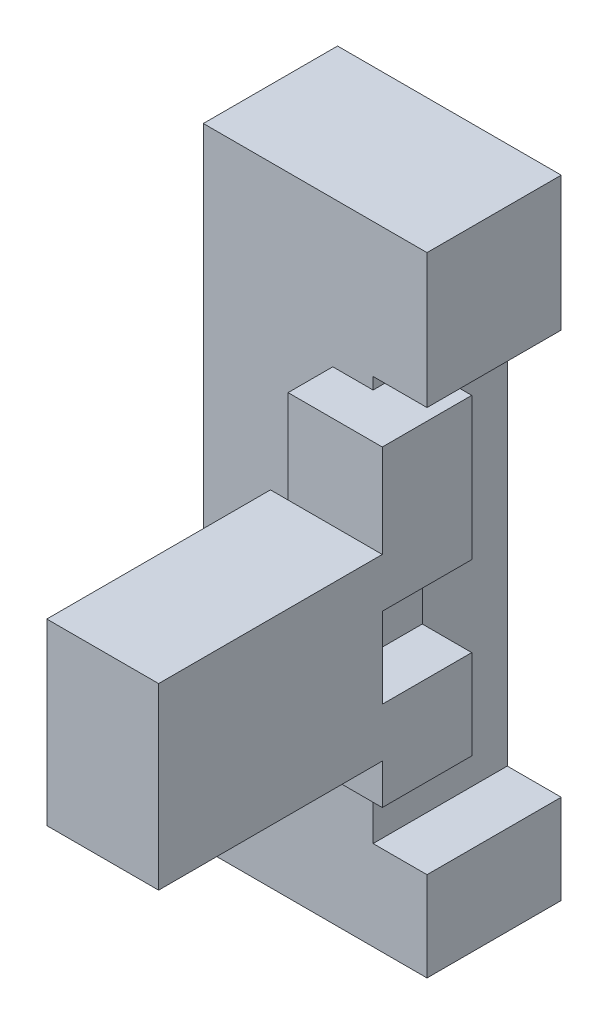
ISO-10303-21;
HEADER;
FILE_DESCRIPTION(('STEP AP214'),'2;1');
FILE_NAME('part.step','',(''),(''),'','','');
FILE_SCHEMA(('AUTOMOTIVE_DESIGN { 1 0 10303 214 1 1 1 1 }'));
ENDSEC;
DATA;
#1=APPLICATION_CONTEXT('core data for automotive mechanical design processes');
#2=APPLICATION_PROTOCOL_DEFINITION('international standard','automotive_design',2000,#1);
#3=PRODUCT_CONTEXT('',#1,'mechanical');
#4=PRODUCT('Part','Part','',(#3));
#5=PRODUCT_RELATED_PRODUCT_CATEGORY('part','',(#4));
#6=PRODUCT_DEFINITION_FORMATION('','',#4);
#7=PRODUCT_DEFINITION_CONTEXT('part definition',#1,'design');
#8=PRODUCT_DEFINITION('design','',#6,#7);
#9=PRODUCT_DEFINITION_SHAPE('','',#8);
#10=(LENGTH_UNIT() NAMED_UNIT(*) SI_UNIT(.MILLI.,.METRE.));
#11=(NAMED_UNIT(*) PLANE_ANGLE_UNIT() SI_UNIT($,.RADIAN.));
#12=(NAMED_UNIT(*) SI_UNIT($,.STERADIAN.) SOLID_ANGLE_UNIT());
#13=UNCERTAINTY_MEASURE_WITH_UNIT(LENGTH_MEASURE(1.E-05),#10,'distance_accuracy_value','');
#14=(GEOMETRIC_REPRESENTATION_CONTEXT(3) GLOBAL_UNCERTAINTY_ASSIGNED_CONTEXT((#13)) GLOBAL_UNIT_ASSIGNED_CONTEXT((#10,
#11,#12)) REPRESENTATION_CONTEXT('',''));
#15=CARTESIAN_POINT('',(0.,0.,0.));
#16=DIRECTION('',(0.,0.,1.));
#17=DIRECTION('',(1.,0.,0.));
#18=AXIS2_PLACEMENT_3D('',#15,#16,#17);
#19=CARTESIAN_POINT('',(0.,0.,2.));
#20=DIRECTION('',(0.,0.,1.));
#21=DIRECTION('',(1.,0.,0.));
#22=AXIS2_PLACEMENT_3D('',#19,#20,#21);
#23=PLANE('',#22);
#24=DIRECTION('',(1.,0.,0.));
#25=VECTOR('',#24,1.);
#26=CARTESIAN_POINT('',(45.220609876218,-8.72106443700142,2.));
#27=LINE('',#26,#25);
#28=CARTESIAN_POINT('',(43.114751496181,-8.72106443700142,2.));
#29=VERTEX_POINT('',#28);
#30=CARTESIAN_POINT('',(45.220609876218,-8.72106443700142,2.));
#31=VERTEX_POINT('',#30);
#32=EDGE_CURVE('E294',#29,#31,#27,.T.);
#33=ORIENTED_EDGE('',*,*,#32,.F.);
#34=DIRECTION('',(0.,-1.,0.));
#35=VECTOR('',#34,1.);
#36=CARTESIAN_POINT('',(43.114751496181,-9.62106443700142,2.));
#37=LINE('',#36,#35);
#38=CARTESIAN_POINT('',(43.114751496181,-9.62106443700142,2.));
#39=VERTEX_POINT('',#38);
#40=EDGE_CURVE('E321',#29,#39,#37,.T.);
#41=ORIENTED_EDGE('',*,*,#40,.T.);
#42=DIRECTION('',(1.,0.,0.));
#43=VECTOR('',#42,1.);
#44=CARTESIAN_POINT('',(44.114751496181,-9.62106443700142,2.));
#45=LINE('',#44,#43);
#46=CARTESIAN_POINT('',(45.220609876218,-9.62106443700142,2.));
#47=VERTEX_POINT('',#46);
#48=EDGE_CURVE('E324',#39,#47,#45,.T.);
#49=ORIENTED_EDGE('',*,*,#48,.T.);
#50=DIRECTION('',(0.,1.,0.));
#51=VECTOR('',#50,1.);
#52=CARTESIAN_POINT('',(45.220609876218,-7.62106443700142,2.));
#53=LINE('',#52,#51);
#54=EDGE_CURVE('E56',#47,#31,#53,.T.);
#55=ORIENTED_EDGE('',*,*,#54,.T.);
#56=EDGE_LOOP('',(#33,#41,#49,#55));
#57=FACE_BOUND('',#56,.T.);
#58=ADVANCED_FACE('F33',(#57),#23,.T.);
#59=CARTESIAN_POINT('',(44.714751496181,-7.62106443700142,2.));
#60=DIRECTION('',(0.,-1.,0.));
#61=DIRECTION('',(0.,0.,-1.));
#62=AXIS2_PLACEMENT_3D('',#59,#60,#61);
#63=PLANE('',#62);
#64=DIRECTION('',(-1.,0.,0.));
#65=VECTOR('',#64,1.);
#66=CARTESIAN_POINT('',(44.714751496181,-7.62106443700142,0.));
#67=LINE('',#66,#65);
#68=CARTESIAN_POINT('',(45.220609876218,-7.62106443700142,0.));
#69=VERTEX_POINT('',#68);
#70=CARTESIAN_POINT('',(44.114751496181,-7.62106443700142,0.));
#71=VERTEX_POINT('',#70);
#72=EDGE_CURVE('E306',#69,#71,#67,.T.);
#73=ORIENTED_EDGE('',*,*,#72,.T.);
#74=DIRECTION('',(0.,0.,-1.));
#75=VECTOR('',#74,1.);
#76=CARTESIAN_POINT('',(44.114751496181,-7.62106443700142,2.));
#77=LINE('',#76,#75);
#78=CARTESIAN_POINT('',(44.114751496181,-7.62106443700142,2.));
#79=VERTEX_POINT('',#78);
#80=EDGE_CURVE('E364',#79,#71,#77,.T.);
#81=ORIENTED_EDGE('',*,*,#80,.F.);
#82=DIRECTION('',(-1.,0.,0.));
#83=VECTOR('',#82,1.);
#84=CARTESIAN_POINT('',(45.220609876218,-7.62106443700142,2.));
#85=LINE('',#84,#83);
#86=CARTESIAN_POINT('',(45.220609876218,-7.62106443700142,2.));
#87=VERTEX_POINT('',#86);
#88=EDGE_CURVE('E307',#87,#79,#85,.T.);
#89=ORIENTED_EDGE('',*,*,#88,.F.);
#90=DIRECTION('',(0.,0.,-1.));
#91=VECTOR('',#90,1.);
#92=CARTESIAN_POINT('',(45.220609876218,-7.62106443700142,2.));
#93=LINE('',#92,#91);
#94=EDGE_CURVE('E328',#87,#69,#93,.T.);
#95=ORIENTED_EDGE('',*,*,#94,.T.);
#96=EDGE_LOOP('',(#73,#81,#89,#95));
#97=FACE_BOUND('',#96,.T.);
#98=ADVANCED_FACE('F35',(#97),#63,.F.);
#99=CARTESIAN_POINT('',(44.114751496181,-5.82106443700142,2.));
#100=DIRECTION('',(-1.,0.,0.));
#101=DIRECTION('',(0.,0.,1.));
#102=AXIS2_PLACEMENT_3D('',#99,#100,#101);
#103=PLANE('',#102);
#104=DIRECTION('',(0.,1.,0.));
#105=VECTOR('',#104,1.);
#106=CARTESIAN_POINT('',(44.114751496181,-5.82106443700142,0.));
#107=LINE('',#106,#105);
#108=CARTESIAN_POINT('',(44.114751496181,-5.82106443700142,0.));
#109=VERTEX_POINT('',#108);
#110=EDGE_CURVE('E330',#71,#109,#107,.T.);
#111=ORIENTED_EDGE('',*,*,#110,.T.);
#112=DIRECTION('',(0.,0.,-1.));
#113=VECTOR('',#112,1.);
#114=CARTESIAN_POINT('',(44.114751496181,-5.82106443700142,2.));
#115=LINE('',#114,#113);
#116=CARTESIAN_POINT('',(44.114751496181,-5.82106443700142,2.));
#117=VERTEX_POINT('',#116);
#118=EDGE_CURVE('E361',#117,#109,#115,.T.);
#119=ORIENTED_EDGE('',*,*,#118,.F.);
#120=DIRECTION('',(0.,1.,0.));
#121=VECTOR('',#120,1.);
#122=CARTESIAN_POINT('',(44.114751496181,-5.82106443700142,2.));
#123=LINE('',#122,#121);
#124=EDGE_CURVE('E310',#79,#117,#123,.T.);
#125=ORIENTED_EDGE('',*,*,#124,.F.);
#126=ORIENTED_EDGE('',*,*,#80,.T.);
#127=EDGE_LOOP('',(#111,#119,#125,#126));
#128=FACE_BOUND('',#127,.T.);
#129=ADVANCED_FACE('F408',(#128),#103,.F.);
#130=CARTESIAN_POINT('',(45.220609876218,-5.82106443700142,2.));
#131=DIRECTION('',(0.,1.,0.));
#132=DIRECTION('',(0.,0.,1.));
#133=AXIS2_PLACEMENT_3D('',#130,#131,#132);
#134=PLANE('',#133);
#135=DIRECTION('',(1.,0.,0.));
#136=VECTOR('',#135,1.);
#137=CARTESIAN_POINT('',(45.220609876218,-5.82106443700142,0.));
#138=LINE('',#137,#136);
#139=CARTESIAN_POINT('',(45.220609876218,-5.82106443700142,0.));
#140=VERTEX_POINT('',#139);
#141=EDGE_CURVE('E332',#109,#140,#138,.T.);
#142=ORIENTED_EDGE('',*,*,#141,.T.);
#143=DIRECTION('',(0.,0.,-1.));
#144=VECTOR('',#143,1.);
#145=CARTESIAN_POINT('',(45.220609876218,-5.82106443700142,2.));
#146=LINE('',#145,#144);
#147=CARTESIAN_POINT('',(45.220609876218,-5.82106443700142,2.));
#148=VERTEX_POINT('',#147);
#149=EDGE_CURVE('E358',#148,#140,#146,.T.);
#150=ORIENTED_EDGE('',*,*,#149,.F.);
#151=DIRECTION('',(1.,0.,0.));
#152=VECTOR('',#151,1.);
#153=CARTESIAN_POINT('',(45.220609876218,-5.82106443700142,2.));
#154=LINE('',#153,#152);
#155=EDGE_CURVE('E314',#117,#148,#154,.T.);
#156=ORIENTED_EDGE('',*,*,#155,.F.);
#157=ORIENTED_EDGE('',*,*,#118,.T.);
#158=EDGE_LOOP('',(#142,#150,#156,#157));
#159=FACE_BOUND('',#158,.T.);
#160=ADVANCED_FACE('F415',(#159),#134,.F.);
#161=CARTESIAN_POINT('',(43.114751496181,-2.64106443700142,2.));
#162=DIRECTION('',(0.,-1.,0.));
#163=DIRECTION('',(0.,0.,-1.));
#164=AXIS2_PLACEMENT_3D('',#161,#162,#163);
#165=PLANE('',#164);
#166=DIRECTION('',(-1.,0.,0.));
#167=VECTOR('',#166,1.);
#168=CARTESIAN_POINT('',(43.114751496181,-2.64106443700142,0.));
#169=LINE('',#168,#167);
#170=CARTESIAN_POINT('',(45.220609876218,-2.64106443700142,0.));
#171=VERTEX_POINT('',#170);
#172=CARTESIAN_POINT('',(44.014751496181,-2.64106443700142,0.));
#173=VERTEX_POINT('',#172);
#174=EDGE_CURVE('E337',#171,#173,#169,.T.);
#175=ORIENTED_EDGE('',*,*,#174,.T.);
#176=DIRECTION('',(0.,0.,1.));
#177=VECTOR('',#176,1.);
#178=CARTESIAN_POINT('',(44.014751496181,-2.64106443700142,2.));
#179=LINE('',#178,#177);
#180=CARTESIAN_POINT('',(44.014751496181,-2.64106443700142,1.));
#181=VERTEX_POINT('',#180);
#182=EDGE_CURVE('E48',#173,#181,#179,.T.);
#183=ORIENTED_EDGE('',*,*,#182,.T.);
#184=DIRECTION('',(-1.,0.,0.));
#185=VECTOR('',#184,1.);
#186=CARTESIAN_POINT('',(43.114751496181,-2.64106443700142,1.));
#187=LINE('',#186,#185);
#188=CARTESIAN_POINT('',(43.114751496181,-2.64106443700142,1.));
#189=VERTEX_POINT('',#188);
#190=EDGE_CURVE('E269',#181,#189,#187,.T.);
#191=ORIENTED_EDGE('',*,*,#190,.T.);
#192=DIRECTION('',(0.,0.,-1.));
#193=VECTOR('',#192,1.);
#194=CARTESIAN_POINT('',(43.114751496181,-2.64106443700142,2.));
#195=LINE('',#194,#193);
#196=CARTESIAN_POINT('',(43.114751496181,-2.64106443700142,2.));
#197=VERTEX_POINT('',#196);
#198=EDGE_CURVE('E352',#197,#189,#195,.T.);
#199=ORIENTED_EDGE('',*,*,#198,.F.);
#200=DIRECTION('',(-1.,0.,0.));
#201=VECTOR('',#200,1.);
#202=CARTESIAN_POINT('',(43.114751496181,-2.64106443700142,2.));
#203=LINE('',#202,#201);
#204=CARTESIAN_POINT('',(45.220609876218,-2.64106443700142,2.));
#205=VERTEX_POINT('',#204);
#206=EDGE_CURVE('E319',#205,#197,#203,.T.);
#207=ORIENTED_EDGE('',*,*,#206,.F.);
#208=DIRECTION('',(0.,0.,-1.));
#209=VECTOR('',#208,1.);
#210=CARTESIAN_POINT('',(45.220609876218,-2.64106443700142,2.));
#211=LINE('',#210,#209);
#212=EDGE_CURVE('E355',#205,#171,#211,.T.);
#213=ORIENTED_EDGE('',*,*,#212,.T.);
#214=EDGE_LOOP('',(#175,#183,#191,#199,#207,#213));
#215=FACE_BOUND('',#214,.T.);
#216=ADVANCED_FACE('F417',(#215),#165,.F.);
#217=CARTESIAN_POINT('',(43.114751496181,-9.62106443700142,2.));
#218=DIRECTION('',(1.,0.,0.));
#219=DIRECTION('',(0.,0.,-1.));
#220=AXIS2_PLACEMENT_3D('',#217,#218,#219);
#221=PLANE('',#220);
#222=ORIENTED_EDGE('',*,*,#198,.T.);
#223=DIRECTION('',(0.,-1.,0.));
#224=VECTOR('',#223,1.);
#225=CARTESIAN_POINT('',(43.114751496181,-9.62106443700142,1.));
#226=LINE('',#225,#224);
#227=CARTESIAN_POINT('',(43.114751496181,-9.62106443700142,1.));
#228=VERTEX_POINT('',#227);
#229=EDGE_CURVE('E266',#189,#228,#226,.T.);
#230=ORIENTED_EDGE('',*,*,#229,.T.);
#231=DIRECTION('',(0.,0.,-1.));
#232=VECTOR('',#231,1.);
#233=CARTESIAN_POINT('',(43.114751496181,-9.62106443700142,2.));
#234=LINE('',#233,#232);
#235=EDGE_CURVE('E349',#39,#228,#234,.T.);
#236=ORIENTED_EDGE('',*,*,#235,.F.);
#237=ORIENTED_EDGE('',*,*,#40,.F.);
#238=CARTESIAN_POINT('',(43.114751496181,-4.72106443700142,2.));
#239=VERTEX_POINT('',#238);
#240=EDGE_CURVE('E325',#239,#29,#37,.T.);
#241=ORIENTED_EDGE('',*,*,#240,.F.);
#242=EDGE_CURVE('E322',#197,#239,#37,.T.);
#243=ORIENTED_EDGE('',*,*,#242,.F.);
#244=EDGE_LOOP('',(#222,#230,#236,#237,#241,#243));
#245=FACE_BOUND('',#244,.T.);
#246=ADVANCED_FACE('F397',(#245),#221,.F.);
#247=CARTESIAN_POINT('',(45.220609876218,-9.62106443700142,2.));
#248=DIRECTION('',(0.,1.,0.));
#249=DIRECTION('',(0.,0.,1.));
#250=AXIS2_PLACEMENT_3D('',#247,#248,#249);
#251=PLANE('',#250);
#252=DIRECTION('',(1.,0.,0.));
#253=VECTOR('',#252,1.);
#254=CARTESIAN_POINT('',(45.220609876218,-9.62106443700142,1.));
#255=LINE('',#254,#253);
#256=CARTESIAN_POINT('',(44.014751496181,-9.62106443700142,1.));
#257=VERTEX_POINT('',#256);
#258=EDGE_CURVE('E11',#228,#257,#255,.T.);
#259=ORIENTED_EDGE('',*,*,#258,.T.);
#260=DIRECTION('',(0.,0.,-1.));
#261=VECTOR('',#260,1.);
#262=CARTESIAN_POINT('',(44.014751496181,-9.62106443700142,2.));
#263=LINE('',#262,#261);
#264=CARTESIAN_POINT('',(44.014751496181,-9.62106443700142,0.));
#265=VERTEX_POINT('',#264);
#266=EDGE_CURVE('E251',#257,#265,#263,.T.);
#267=ORIENTED_EDGE('',*,*,#266,.T.);
#268=DIRECTION('',(1.,0.,0.));
#269=VECTOR('',#268,1.);
#270=CARTESIAN_POINT('',(45.220609876218,-9.62106443700142,0.));
#271=LINE('',#270,#269);
#272=CARTESIAN_POINT('',(45.220609876218,-9.62106443700142,0.));
#273=VERTEX_POINT('',#272);
#274=EDGE_CURVE('E340',#265,#273,#271,.T.);
#275=ORIENTED_EDGE('',*,*,#274,.T.);
#276=DIRECTION('',(0.,0.,-1.));
#277=VECTOR('',#276,1.);
#278=CARTESIAN_POINT('',(45.220609876218,-9.62106443700142,2.));
#279=LINE('',#278,#277);
#280=EDGE_CURVE('E346',#47,#273,#279,.T.);
#281=ORIENTED_EDGE('',*,*,#280,.F.);
#282=ORIENTED_EDGE('',*,*,#48,.F.);
#283=ORIENTED_EDGE('',*,*,#235,.T.);
#284=EDGE_LOOP('',(#259,#267,#275,#281,#282,#283));
#285=FACE_BOUND('',#284,.T.);
#286=ADVANCED_FACE('F399',(#285),#251,.F.);
#287=CARTESIAN_POINT('',(45.220609876218,-7.62106443700142,2.));
#288=DIRECTION('',(-1.,0.,0.));
#289=DIRECTION('',(0.,0.,1.));
#290=AXIS2_PLACEMENT_3D('',#287,#288,#289);
#291=PLANE('',#290);
#292=DIRECTION('',(0.,1.,0.));
#293=VECTOR('',#292,1.);
#294=CARTESIAN_POINT('',(45.220609876218,-7.62106443700142,0.));
#295=LINE('',#294,#293);
#296=EDGE_CURVE('E311',#273,#69,#295,.T.);
#297=ORIENTED_EDGE('',*,*,#296,.T.);
#298=ORIENTED_EDGE('',*,*,#94,.F.);
#299=DIRECTION('',(0.,1.,0.));
#300=VECTOR('',#299,1.);
#301=CARTESIAN_POINT('',(45.220609876218,-4.72106443700142,2.));
#302=LINE('',#301,#300);
#303=EDGE_CURVE('E272',#87,#148,#302,.T.);
#304=ORIENTED_EDGE('',*,*,#303,.T.);
#305=ORIENTED_EDGE('',*,*,#149,.T.);
#306=DIRECTION('',(0.,1.,0.));
#307=VECTOR('',#306,1.);
#308=CARTESIAN_POINT('',(45.220609876218,-2.64106443700142,0.));
#309=LINE('',#308,#307);
#310=EDGE_CURVE('E335',#140,#171,#309,.T.);
#311=ORIENTED_EDGE('',*,*,#310,.T.);
#312=ORIENTED_EDGE('',*,*,#212,.F.);
#313=DIRECTION('',(0.,1.,0.));
#314=VECTOR('',#313,1.);
#315=CARTESIAN_POINT('',(45.220609876218,-4.64106443700142,2.));
#316=LINE('',#315,#314);
#317=CARTESIAN_POINT('',(45.220609876218,-4.72106443700142,2.));
#318=VERTEX_POINT('',#317);
#319=EDGE_CURVE('E317',#318,#205,#316,.T.);
#320=ORIENTED_EDGE('',*,*,#319,.F.);
#321=DIRECTION('',(0.,0.,-1.));
#322=VECTOR('',#321,1.);
#323=CARTESIAN_POINT('',(45.220609876218,-4.72106443700142,7.));
#324=LINE('',#323,#322);
#325=CARTESIAN_POINT('',(45.220609876218,-4.72106443700142,7.));
#326=VERTEX_POINT('',#325);
#327=EDGE_CURVE('E303',#326,#318,#324,.T.);
#328=ORIENTED_EDGE('',*,*,#327,.F.);
#329=DIRECTION('',(0.,1.,0.));
#330=VECTOR('',#329,1.);
#331=CARTESIAN_POINT('',(45.220609876218,-4.72106443700142,7.));
#332=LINE('',#331,#330);
#333=CARTESIAN_POINT('',(45.220609876218,-8.72106443700142,7.));
#334=VERTEX_POINT('',#333);
#335=EDGE_CURVE('E273',#334,#326,#332,.T.);
#336=ORIENTED_EDGE('',*,*,#335,.F.);
#337=DIRECTION('',(0.,0.,-1.));
#338=VECTOR('',#337,1.);
#339=CARTESIAN_POINT('',(45.220609876218,-8.72106443700142,7.));
#340=LINE('',#339,#338);
#341=EDGE_CURVE('E283',#334,#31,#340,.T.);
#342=ORIENTED_EDGE('',*,*,#341,.T.);
#343=ORIENTED_EDGE('',*,*,#54,.F.);
#344=ORIENTED_EDGE('',*,*,#280,.T.);
#345=EDGE_LOOP('',(#297,#298,#304,#305,#311,#312,#320,#328,#336,#342,#343,#344));
#346=FACE_BOUND('',#345,.T.);
#347=ADVANCED_FACE('F377',(#346),#291,.F.);
#348=DIRECTION('',(-1.,0.,0.));
#349=VECTOR('',#348,1.);
#350=CARTESIAN_POINT('',(45.220609876218,-4.72106443700142,2.));
#351=LINE('',#350,#349);
#352=EDGE_CURVE('E287',#318,#239,#351,.T.);
#353=ORIENTED_EDGE('',*,*,#352,.F.);
#354=ORIENTED_EDGE('',*,*,#319,.T.);
#355=ORIENTED_EDGE('',*,*,#206,.T.);
#356=ORIENTED_EDGE('',*,*,#242,.T.);
#357=EDGE_LOOP('',(#353,#354,#355,#356));
#358=FACE_BOUND('',#357,.T.);
#359=ADVANCED_FACE('F434',(#358),#23,.T.);
#360=CARTESIAN_POINT('',(0.,0.,0.));
#361=DIRECTION('',(0.,0.,1.));
#362=DIRECTION('',(1.,0.,0.));
#363=AXIS2_PLACEMENT_3D('',#360,#361,#362);
#364=PLANE('',#363);
#365=ORIENTED_EDGE('',*,*,#274,.F.);
#366=DIRECTION('',(0.,1.,0.));
#367=VECTOR('',#366,1.);
#368=CARTESIAN_POINT('',(44.014751496181,0.,0.));
#369=LINE('',#368,#367);
#370=EDGE_CURVE('E41',#265,#173,#369,.T.);
#371=ORIENTED_EDGE('',*,*,#370,.T.);
#372=ORIENTED_EDGE('',*,*,#174,.F.);
#373=ORIENTED_EDGE('',*,*,#310,.F.);
#374=ORIENTED_EDGE('',*,*,#141,.F.);
#375=ORIENTED_EDGE('',*,*,#110,.F.);
#376=ORIENTED_EDGE('',*,*,#72,.F.);
#377=ORIENTED_EDGE('',*,*,#296,.F.);
#378=EDGE_LOOP('',(#365,#371,#372,#373,#374,#375,#376,#377));
#379=FACE_BOUND('',#378,.T.);
#380=ADVANCED_FACE('F401',(#379),#364,.F.);
#381=CARTESIAN_POINT('',(0.,0.,2.));
#382=DIRECTION('',(0.,0.,-1.));
#383=DIRECTION('',(-1.,0.,0.));
#384=AXIS2_PLACEMENT_3D('',#381,#382,#383);
#385=PLANE('',#384);
#386=ORIENTED_EDGE('',*,*,#303,.F.);
#387=ORIENTED_EDGE('',*,*,#88,.T.);
#388=ORIENTED_EDGE('',*,*,#124,.T.);
#389=ORIENTED_EDGE('',*,*,#155,.T.);
#390=EDGE_LOOP('',(#386,#387,#388,#389));
#391=FACE_BOUND('',#390,.T.);
#392=ADVANCED_FACE('F412',(#391),#385,.T.);
#393=CARTESIAN_POINT('',(45.220609876218,-4.72106443700142,7.));
#394=DIRECTION('',(0.,-1.,0.));
#395=DIRECTION('',(0.,0.,-1.));
#396=AXIS2_PLACEMENT_3D('',#393,#394,#395);
#397=PLANE('',#396);
#398=ORIENTED_EDGE('',*,*,#352,.T.);
#399=CARTESIAN_POINT('',(42.720609876218,-4.72106443700142,2.));
#400=VERTEX_POINT('',#399);
#401=EDGE_CURVE('E286',#239,#400,#351,.T.);
#402=ORIENTED_EDGE('',*,*,#401,.T.);
#403=DIRECTION('',(0.,0.,-1.));
#404=VECTOR('',#403,1.);
#405=CARTESIAN_POINT('',(42.720609876218,-4.72106443700142,7.));
#406=LINE('',#405,#404);
#407=CARTESIAN_POINT('',(42.720609876218,-4.72106443700142,7.));
#408=VERTEX_POINT('',#407);
#409=EDGE_CURVE('E300',#408,#400,#406,.T.);
#410=ORIENTED_EDGE('',*,*,#409,.F.);
#411=DIRECTION('',(-1.,0.,0.));
#412=VECTOR('',#411,1.);
#413=CARTESIAN_POINT('',(45.220609876218,-4.72106443700142,7.));
#414=LINE('',#413,#412);
#415=EDGE_CURVE('E276',#326,#408,#414,.T.);
#416=ORIENTED_EDGE('',*,*,#415,.F.);
#417=ORIENTED_EDGE('',*,*,#327,.T.);
#418=EDGE_LOOP('',(#398,#402,#410,#416,#417));
#419=FACE_BOUND('',#418,.T.);
#420=ADVANCED_FACE('F422',(#419),#397,.F.);
#421=CARTESIAN_POINT('',(42.720609876218,-4.72106443700142,7.));
#422=DIRECTION('',(1.,0.,0.));
#423=DIRECTION('',(0.,0.,-1.));
#424=AXIS2_PLACEMENT_3D('',#421,#422,#423);
#425=PLANE('',#424);
#426=DIRECTION('',(0.,-1.,0.));
#427=VECTOR('',#426,1.);
#428=CARTESIAN_POINT('',(42.720609876218,-4.72106443700142,2.));
#429=LINE('',#428,#427);
#430=CARTESIAN_POINT('',(42.720609876218,-8.72106443700142,2.));
#431=VERTEX_POINT('',#430);
#432=EDGE_CURVE('E290',#400,#431,#429,.T.);
#433=ORIENTED_EDGE('',*,*,#432,.T.);
#434=DIRECTION('',(0.,0.,-1.));
#435=VECTOR('',#434,1.);
#436=CARTESIAN_POINT('',(42.720609876218,-8.72106443700142,7.));
#437=LINE('',#436,#435);
#438=CARTESIAN_POINT('',(42.720609876218,-8.72106443700142,7.));
#439=VERTEX_POINT('',#438);
#440=EDGE_CURVE('E297',#439,#431,#437,.T.);
#441=ORIENTED_EDGE('',*,*,#440,.F.);
#442=DIRECTION('',(0.,-1.,0.));
#443=VECTOR('',#442,1.);
#444=CARTESIAN_POINT('',(42.720609876218,-4.72106443700142,7.));
#445=LINE('',#444,#443);
#446=EDGE_CURVE('E279',#408,#439,#445,.T.);
#447=ORIENTED_EDGE('',*,*,#446,.F.);
#448=ORIENTED_EDGE('',*,*,#409,.T.);
#449=EDGE_LOOP('',(#433,#441,#447,#448));
#450=FACE_BOUND('',#449,.T.);
#451=ADVANCED_FACE('F423',(#450),#425,.F.);
#452=CARTESIAN_POINT('',(45.220609876218,-8.72106443700142,7.));
#453=DIRECTION('',(0.,1.,0.));
#454=DIRECTION('',(0.,0.,1.));
#455=AXIS2_PLACEMENT_3D('',#452,#453,#454);
#456=PLANE('',#455);
#457=EDGE_CURVE('E277',#431,#29,#27,.T.);
#458=ORIENTED_EDGE('',*,*,#457,.T.);
#459=ORIENTED_EDGE('',*,*,#32,.T.);
#460=ORIENTED_EDGE('',*,*,#341,.F.);
#461=DIRECTION('',(1.,0.,0.));
#462=VECTOR('',#461,1.);
#463=CARTESIAN_POINT('',(45.220609876218,-8.72106443700142,7.));
#464=LINE('',#463,#462);
#465=EDGE_CURVE('E281',#439,#334,#464,.T.);
#466=ORIENTED_EDGE('',*,*,#465,.F.);
#467=ORIENTED_EDGE('',*,*,#440,.T.);
#468=EDGE_LOOP('',(#458,#459,#460,#466,#467));
#469=FACE_BOUND('',#468,.T.);
#470=ADVANCED_FACE('F371',(#469),#456,.F.);
#471=CARTESIAN_POINT('',(0.,0.,7.));
#472=DIRECTION('',(0.,0.,-1.));
#473=DIRECTION('',(-1.,0.,0.));
#474=AXIS2_PLACEMENT_3D('',#471,#472,#473);
#475=PLANE('',#474);
#476=ORIENTED_EDGE('',*,*,#335,.T.);
#477=ORIENTED_EDGE('',*,*,#415,.T.);
#478=ORIENTED_EDGE('',*,*,#446,.T.);
#479=ORIENTED_EDGE('',*,*,#465,.T.);
#480=EDGE_LOOP('',(#476,#477,#478,#479));
#481=FACE_BOUND('',#480,.T.);
#482=ADVANCED_FACE('F381',(#481),#475,.F.);
#483=ORIENTED_EDGE('',*,*,#401,.F.);
#484=ORIENTED_EDGE('',*,*,#240,.T.);
#485=ORIENTED_EDGE('',*,*,#457,.F.);
#486=ORIENTED_EDGE('',*,*,#432,.F.);
#487=EDGE_LOOP('',(#483,#484,#485,#486));
#488=FACE_BOUND('',#487,.T.);
#489=ADVANCED_FACE('F390',(#488),#385,.T.);
#490=CARTESIAN_POINT('',(0.,0.,1.));
#491=DIRECTION('',(0.,0.,1.));
#492=DIRECTION('',(1.,0.,0.));
#493=AXIS2_PLACEMENT_3D('',#490,#491,#492);
#494=PLANE('',#493);
#495=ORIENTED_EDGE('',*,*,#190,.F.);
#496=DIRECTION('',(0.,-1.,0.));
#497=VECTOR('',#496,1.);
#498=CARTESIAN_POINT('',(44.014751496181,-2.37771268992709,1.));
#499=LINE('',#498,#497);
#500=CARTESIAN_POINT('',(44.014751496181,-2.37771268992709,1.));
#501=VERTEX_POINT('',#500);
#502=EDGE_CURVE('E231',#501,#181,#499,.T.);
#503=ORIENTED_EDGE('',*,*,#502,.F.);
#504=DIRECTION('',(-1.,0.,0.));
#505=VECTOR('',#504,1.);
#506=CARTESIAN_POINT('',(44.014751496181,-2.37771268992709,1.));
#507=LINE('',#506,#505);
#508=CARTESIAN_POINT('',(45.220609876218,-2.37771268992709,1.));
#509=VERTEX_POINT('',#508);
#510=EDGE_CURVE('E195',#509,#501,#507,.T.);
#511=ORIENTED_EDGE('',*,*,#510,.F.);
#512=DIRECTION('',(0.,-1.,0.));
#513=VECTOR('',#512,1.);
#514=CARTESIAN_POINT('',(45.220609876218,-2.37771268992709,1.));
#515=LINE('',#514,#513);
#516=CARTESIAN_POINT('',(45.220609876218,0.622287310072913,1.));
#517=VERTEX_POINT('',#516);
#518=EDGE_CURVE('E198',#517,#509,#515,.T.);
#519=ORIENTED_EDGE('',*,*,#518,.F.);
#520=DIRECTION('',(1.,0.,0.));
#521=VECTOR('',#520,1.);
#522=CARTESIAN_POINT('',(45.220609876218,0.622287310072913,1.));
#523=LINE('',#522,#521);
#524=CARTESIAN_POINT('',(40.220609876218,0.622287310072913,1.));
#525=VERTEX_POINT('',#524);
#526=EDGE_CURVE('E244',#525,#517,#523,.T.);
#527=ORIENTED_EDGE('',*,*,#526,.F.);
#528=DIRECTION('',(0.,1.,0.));
#529=VECTOR('',#528,1.);
#530=CARTESIAN_POINT('',(40.220609876218,-12.42096681139,1.));
#531=LINE('',#530,#529);
#532=CARTESIAN_POINT('',(40.220609876218,-13.42096681139,1.));
#533=VERTEX_POINT('',#532);
#534=EDGE_CURVE('E242',#533,#525,#531,.T.);
#535=ORIENTED_EDGE('',*,*,#534,.F.);
#536=DIRECTION('',(-1.,0.,0.));
#537=VECTOR('',#536,1.);
#538=CARTESIAN_POINT('',(40.220609876218,-13.42096681139,1.));
#539=LINE('',#538,#537);
#540=CARTESIAN_POINT('',(45.220609876218,-13.42096681139,1.));
#541=VERTEX_POINT('',#540);
#542=EDGE_CURVE('E239',#541,#533,#539,.T.);
#543=ORIENTED_EDGE('',*,*,#542,.F.);
#544=DIRECTION('',(0.,-1.,0.));
#545=VECTOR('',#544,1.);
#546=CARTESIAN_POINT('',(45.220609876218,-13.42096681139,1.));
#547=LINE('',#546,#545);
#548=CARTESIAN_POINT('',(45.220609876218,-11.42096681139,1.));
#549=VERTEX_POINT('',#548);
#550=EDGE_CURVE('E236',#549,#541,#547,.T.);
#551=ORIENTED_EDGE('',*,*,#550,.F.);
#552=DIRECTION('',(1.,0.,0.));
#553=VECTOR('',#552,1.);
#554=CARTESIAN_POINT('',(45.220609876218,-11.42096681139,1.));
#555=LINE('',#554,#553);
#556=CARTESIAN_POINT('',(44.014751496181,-11.42096681139,1.));
#557=VERTEX_POINT('',#556);
#558=EDGE_CURVE('E233',#557,#549,#555,.T.);
#559=ORIENTED_EDGE('',*,*,#558,.F.);
#560=EDGE_CURVE('E230',#257,#557,#499,.T.);
#561=ORIENTED_EDGE('',*,*,#560,.F.);
#562=ORIENTED_EDGE('',*,*,#258,.F.);
#563=ORIENTED_EDGE('',*,*,#229,.F.);
#564=EDGE_LOOP('',(#495,#503,#511,#519,#527,#535,#543,#551,#559,#561,#562,#563));
#565=FACE_BOUND('',#564,.T.);
#566=ADVANCED_FACE('F446',(#565),#494,.T.);
#567=CARTESIAN_POINT('',(44.014751496181,-11.42096681139,1.));
#568=DIRECTION('',(1.,0.,0.));
#569=DIRECTION('',(0.,0.,-1.));
#570=AXIS2_PLACEMENT_3D('',#567,#568,#569);
#571=PLANE('',#570);
#572=ORIENTED_EDGE('',*,*,#182,.F.);
#573=ORIENTED_EDGE('',*,*,#370,.F.);
#574=ORIENTED_EDGE('',*,*,#266,.F.);
#575=ORIENTED_EDGE('',*,*,#560,.T.);
#576=DIRECTION('',(0.,0.,-1.));
#577=VECTOR('',#576,1.);
#578=CARTESIAN_POINT('',(44.014751496181,-11.42096681139,1.));
#579=LINE('',#578,#577);
#580=CARTESIAN_POINT('',(44.014751496181,-11.42096681139,-2.));
#581=VERTEX_POINT('',#580);
#582=EDGE_CURVE('E197',#557,#581,#579,.T.);
#583=ORIENTED_EDGE('',*,*,#582,.T.);
#584=DIRECTION('',(0.,-1.,0.));
#585=VECTOR('',#584,1.);
#586=CARTESIAN_POINT('',(44.014751496181,-2.37771268992709,-2.));
#587=LINE('',#586,#585);
#588=CARTESIAN_POINT('',(44.014751496181,-2.37771268992709,-2.));
#589=VERTEX_POINT('',#588);
#590=EDGE_CURVE('E201',#589,#581,#587,.T.);
#591=ORIENTED_EDGE('',*,*,#590,.F.);
#592=DIRECTION('',(0.,0.,-1.));
#593=VECTOR('',#592,1.);
#594=CARTESIAN_POINT('',(44.014751496181,-2.37771268992709,1.));
#595=LINE('',#594,#593);
#596=EDGE_CURVE('E189',#501,#589,#595,.T.);
#597=ORIENTED_EDGE('',*,*,#596,.F.);
#598=ORIENTED_EDGE('',*,*,#502,.T.);
#599=EDGE_LOOP('',(#572,#573,#574,#575,#583,#591,#597,#598));
#600=FACE_BOUND('',#599,.T.);
#601=ADVANCED_FACE('F202',(#600),#571,.T.);
#602=CARTESIAN_POINT('',(44.014751496181,-2.37771268992709,1.));
#603=DIRECTION('',(0.,-1.,0.));
#604=DIRECTION('',(0.,0.,-1.));
#605=AXIS2_PLACEMENT_3D('',#602,#603,#604);
#606=PLANE('',#605);
#607=ORIENTED_EDGE('',*,*,#596,.T.);
#608=DIRECTION('',(-1.,0.,0.));
#609=VECTOR('',#608,1.);
#610=CARTESIAN_POINT('',(44.014751496181,-2.37771268992709,-2.));
#611=LINE('',#610,#609);
#612=CARTESIAN_POINT('',(45.220609876218,-2.37771268992709,-2.));
#613=VERTEX_POINT('',#612);
#614=EDGE_CURVE('E193',#613,#589,#611,.T.);
#615=ORIENTED_EDGE('',*,*,#614,.F.);
#616=DIRECTION('',(0.,0.,-1.));
#617=VECTOR('',#616,1.);
#618=CARTESIAN_POINT('',(45.220609876218,-2.37771268992709,1.));
#619=LINE('',#618,#617);
#620=EDGE_CURVE('E249',#509,#613,#619,.T.);
#621=ORIENTED_EDGE('',*,*,#620,.F.);
#622=ORIENTED_EDGE('',*,*,#510,.T.);
#623=EDGE_LOOP('',(#607,#615,#621,#622));
#624=FACE_BOUND('',#623,.T.);
#625=ADVANCED_FACE('F191',(#624),#606,.T.);
#626=CARTESIAN_POINT('',(45.220609876218,-2.37771268992709,1.));
#627=DIRECTION('',(1.,0.,0.));
#628=DIRECTION('',(0.,0.,-1.));
#629=AXIS2_PLACEMENT_3D('',#626,#627,#628);
#630=PLANE('',#629);
#631=ORIENTED_EDGE('',*,*,#620,.T.);
#632=DIRECTION('',(0.,-1.,0.));
#633=VECTOR('',#632,1.);
#634=CARTESIAN_POINT('',(45.220609876218,-2.37771268992709,-2.));
#635=LINE('',#634,#633);
#636=CARTESIAN_POINT('',(45.220609876218,0.622287310072913,-2.));
#637=VERTEX_POINT('',#636);
#638=EDGE_CURVE('E213',#637,#613,#635,.T.);
#639=ORIENTED_EDGE('',*,*,#638,.F.);
#640=DIRECTION('',(0.,0.,-1.));
#641=VECTOR('',#640,1.);
#642=CARTESIAN_POINT('',(45.220609876218,0.622287310072913,1.));
#643=LINE('',#642,#641);
#644=EDGE_CURVE('E252',#517,#637,#643,.T.);
#645=ORIENTED_EDGE('',*,*,#644,.F.);
#646=ORIENTED_EDGE('',*,*,#518,.T.);
#647=EDGE_LOOP('',(#631,#639,#645,#646));
#648=FACE_BOUND('',#647,.T.);
#649=ADVANCED_FACE('F470',(#648),#630,.T.);
#650=CARTESIAN_POINT('',(45.220609876218,0.622287310072913,1.));
#651=DIRECTION('',(0.,1.,0.));
#652=DIRECTION('',(0.,0.,1.));
#653=AXIS2_PLACEMENT_3D('',#650,#651,#652);
#654=PLANE('',#653);
#655=ORIENTED_EDGE('',*,*,#644,.T.);
#656=DIRECTION('',(1.,0.,0.));
#657=VECTOR('',#656,1.);
#658=CARTESIAN_POINT('',(45.220609876218,0.622287310072913,-2.));
#659=LINE('',#658,#657);
#660=CARTESIAN_POINT('',(40.220609876218,0.622287310072913,-2.));
#661=VERTEX_POINT('',#660);
#662=EDGE_CURVE('E226',#661,#637,#659,.T.);
#663=ORIENTED_EDGE('',*,*,#662,.F.);
#664=DIRECTION('',(0.,0.,-1.));
#665=VECTOR('',#664,1.);
#666=CARTESIAN_POINT('',(40.220609876218,0.622287310072913,1.));
#667=LINE('',#666,#665);
#668=EDGE_CURVE('E254',#525,#661,#667,.T.);
#669=ORIENTED_EDGE('',*,*,#668,.F.);
#670=ORIENTED_EDGE('',*,*,#526,.T.);
#671=EDGE_LOOP('',(#655,#663,#669,#670));
#672=FACE_BOUND('',#671,.T.);
#673=ADVANCED_FACE('F467',(#672),#654,.T.);
#674=CARTESIAN_POINT('',(40.220609876218,0.622287310072913,1.));
#675=DIRECTION('',(-1.,0.,0.));
#676=DIRECTION('',(0.,0.,1.));
#677=AXIS2_PLACEMENT_3D('',#674,#675,#676);
#678=PLANE('',#677);
#679=ORIENTED_EDGE('',*,*,#668,.T.);
#680=DIRECTION('',(0.,1.,0.));
#681=VECTOR('',#680,1.);
#682=CARTESIAN_POINT('',(40.220609876218,-12.42096681139,-2.));
#683=LINE('',#682,#681);
#684=CARTESIAN_POINT('',(40.220609876218,-13.42096681139,-2.));
#685=VERTEX_POINT('',#684);
#686=EDGE_CURVE('E223',#685,#661,#683,.T.);
#687=ORIENTED_EDGE('',*,*,#686,.F.);
#688=DIRECTION('',(0.,0.,-1.));
#689=VECTOR('',#688,1.);
#690=CARTESIAN_POINT('',(40.220609876218,-13.42096681139,1.));
#691=LINE('',#690,#689);
#692=EDGE_CURVE('E256',#533,#685,#691,.T.);
#693=ORIENTED_EDGE('',*,*,#692,.F.);
#694=ORIENTED_EDGE('',*,*,#534,.T.);
#695=EDGE_LOOP('',(#679,#687,#693,#694));
#696=FACE_BOUND('',#695,.T.);
#697=ADVANCED_FACE('F462',(#696),#678,.T.);
#698=CARTESIAN_POINT('',(40.220609876218,-13.42096681139,1.));
#699=DIRECTION('',(0.,-1.,0.));
#700=DIRECTION('',(0.,0.,-1.));
#701=AXIS2_PLACEMENT_3D('',#698,#699,#700);
#702=PLANE('',#701);
#703=ORIENTED_EDGE('',*,*,#692,.T.);
#704=DIRECTION('',(-1.,0.,0.));
#705=VECTOR('',#704,1.);
#706=CARTESIAN_POINT('',(40.220609876218,-13.42096681139,-2.));
#707=LINE('',#706,#705);
#708=CARTESIAN_POINT('',(45.220609876218,-13.42096681139,-2.));
#709=VERTEX_POINT('',#708);
#710=EDGE_CURVE('E220',#709,#685,#707,.T.);
#711=ORIENTED_EDGE('',*,*,#710,.F.);
#712=DIRECTION('',(0.,0.,-1.));
#713=VECTOR('',#712,1.);
#714=CARTESIAN_POINT('',(45.220609876218,-13.42096681139,1.));
#715=LINE('',#714,#713);
#716=EDGE_CURVE('E258',#541,#709,#715,.T.);
#717=ORIENTED_EDGE('',*,*,#716,.F.);
#718=ORIENTED_EDGE('',*,*,#542,.T.);
#719=EDGE_LOOP('',(#703,#711,#717,#718));
#720=FACE_BOUND('',#719,.T.);
#721=ADVANCED_FACE('F460',(#720),#702,.T.);
#722=CARTESIAN_POINT('',(45.220609876218,-13.42096681139,1.));
#723=DIRECTION('',(1.,0.,0.));
#724=DIRECTION('',(0.,0.,-1.));
#725=AXIS2_PLACEMENT_3D('',#722,#723,#724);
#726=PLANE('',#725);
#727=ORIENTED_EDGE('',*,*,#716,.T.);
#728=DIRECTION('',(0.,-1.,0.));
#729=VECTOR('',#728,1.);
#730=CARTESIAN_POINT('',(45.220609876218,-13.42096681139,-2.));
#731=LINE('',#730,#729);
#732=CARTESIAN_POINT('',(45.220609876218,-11.42096681139,-2.));
#733=VERTEX_POINT('',#732);
#734=EDGE_CURVE('E217',#733,#709,#731,.T.);
#735=ORIENTED_EDGE('',*,*,#734,.F.);
#736=DIRECTION('',(0.,0.,-1.));
#737=VECTOR('',#736,1.);
#738=CARTESIAN_POINT('',(45.220609876218,-11.42096681139,1.));
#739=LINE('',#738,#737);
#740=EDGE_CURVE('E260',#549,#733,#739,.T.);
#741=ORIENTED_EDGE('',*,*,#740,.F.);
#742=ORIENTED_EDGE('',*,*,#550,.T.);
#743=EDGE_LOOP('',(#727,#735,#741,#742));
#744=FACE_BOUND('',#743,.T.);
#745=ADVANCED_FACE('F455',(#744),#726,.T.);
#746=CARTESIAN_POINT('',(45.220609876218,-11.42096681139,1.));
#747=DIRECTION('',(0.,1.,0.));
#748=DIRECTION('',(0.,0.,1.));
#749=AXIS2_PLACEMENT_3D('',#746,#747,#748);
#750=PLANE('',#749);
#751=ORIENTED_EDGE('',*,*,#740,.T.);
#752=DIRECTION('',(1.,0.,0.));
#753=VECTOR('',#752,1.);
#754=CARTESIAN_POINT('',(45.220609876218,-11.42096681139,-2.));
#755=LINE('',#754,#753);
#756=EDGE_CURVE('E207',#581,#733,#755,.T.);
#757=ORIENTED_EDGE('',*,*,#756,.F.);
#758=ORIENTED_EDGE('',*,*,#582,.F.);
#759=ORIENTED_EDGE('',*,*,#558,.T.);
#760=EDGE_LOOP('',(#751,#757,#758,#759));
#761=FACE_BOUND('',#760,.T.);
#762=ADVANCED_FACE('F450',(#761),#750,.T.);
#763=CARTESIAN_POINT('',(0.,0.,-2.));
#764=DIRECTION('',(0.,0.,1.));
#765=DIRECTION('',(1.,0.,0.));
#766=AXIS2_PLACEMENT_3D('',#763,#764,#765);
#767=PLANE('',#766);
#768=ORIENTED_EDGE('',*,*,#614,.T.);
#769=ORIENTED_EDGE('',*,*,#590,.T.);
#770=ORIENTED_EDGE('',*,*,#756,.T.);
#771=ORIENTED_EDGE('',*,*,#734,.T.);
#772=ORIENTED_EDGE('',*,*,#710,.T.);
#773=ORIENTED_EDGE('',*,*,#686,.T.);
#774=ORIENTED_EDGE('',*,*,#662,.T.);
#775=ORIENTED_EDGE('',*,*,#638,.T.);
#776=EDGE_LOOP('',(#768,#769,#770,#771,#772,#773,#774,#775));
#777=FACE_BOUND('',#776,.T.);
#778=ADVANCED_FACE('F210',(#777),#767,.F.);
#779=CLOSED_SHELL('',(#58,#98,#129,#160,#216,#246,#286,#347,#359,#380,#392,#420,#451,#470,#482,
#489,#566,#601,#625,#649,#673,#697,#721,#745,#762,#778));
#780=MANIFOLD_SOLID_BREP('B2',#779);
#781=ADVANCED_BREP_SHAPE_REPRESENTATION('',(#18,#780),#14);
#782=SHAPE_DEFINITION_REPRESENTATION(#9,#781);
ENDSEC;
END-ISO-10303-21;
